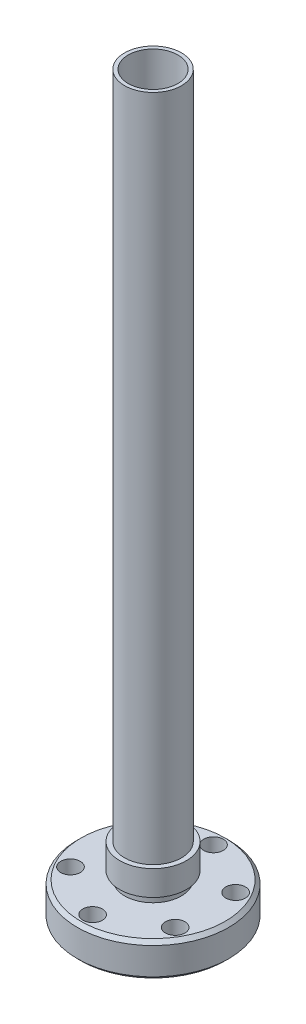
ISO-10303-21;
HEADER;
FILE_DESCRIPTION(('STEP AP214'),'2;1');
FILE_NAME('part.step','',(''),(''),'','','');
FILE_SCHEMA(('AUTOMOTIVE_DESIGN { 1 0 10303 214 1 1 1 1 }'));
ENDSEC;
DATA;
#1=APPLICATION_CONTEXT('core data for automotive mechanical design processes');
#2=APPLICATION_PROTOCOL_DEFINITION('international standard','automotive_design',2000,#1);
#3=PRODUCT_CONTEXT('',#1,'mechanical');
#4=PRODUCT('Part','Part','',(#3));
#5=PRODUCT_RELATED_PRODUCT_CATEGORY('part','',(#4));
#6=PRODUCT_DEFINITION_FORMATION('','',#4);
#7=PRODUCT_DEFINITION_CONTEXT('part definition',#1,'design');
#8=PRODUCT_DEFINITION('design','',#6,#7);
#9=PRODUCT_DEFINITION_SHAPE('','',#8);
#10=(LENGTH_UNIT() NAMED_UNIT(*) SI_UNIT(.MILLI.,.METRE.));
#11=(NAMED_UNIT(*) PLANE_ANGLE_UNIT() SI_UNIT($,.RADIAN.));
#12=(NAMED_UNIT(*) SI_UNIT($,.STERADIAN.) SOLID_ANGLE_UNIT());
#13=UNCERTAINTY_MEASURE_WITH_UNIT(LENGTH_MEASURE(1.E-05),#10,'distance_accuracy_value','');
#14=(GEOMETRIC_REPRESENTATION_CONTEXT(3) GLOBAL_UNCERTAINTY_ASSIGNED_CONTEXT((#13)) GLOBAL_UNIT_ASSIGNED_CONTEXT((#10,
#11,#12)) REPRESENTATION_CONTEXT('',''));
#15=CARTESIAN_POINT('',(0.,0.,0.));
#16=DIRECTION('',(0.,0.,1.));
#17=DIRECTION('',(1.,0.,0.));
#18=AXIS2_PLACEMENT_3D('',#15,#16,#17);
#19=CARTESIAN_POINT('',(0.,164.2364,1.72028497727633E-12));
#20=DIRECTION('',(0.,1.,0.));
#21=DIRECTION('',(0.,0.,-1.));
#22=AXIS2_PLACEMENT_3D('',#19,#20,#21);
#23=PLANE('',#22);
#24=CARTESIAN_POINT('',(0.,164.2364,1.72028497727633E-12));
#25=DIRECTION('',(0.,1.,0.));
#26=DIRECTION('',(1.,0.,0.));
#27=AXIS2_PLACEMENT_3D('',#24,#25,#26);
#28=CIRCLE('',#27,6.35);
#29=CARTESIAN_POINT('',(6.35,164.2364,1.72028497727633E-12));
#30=VERTEX_POINT('',#29);
#31=EDGE_CURVE('E10',#30,#30,#28,.T.);
#32=ORIENTED_EDGE('',*,*,#31,.T.);
#33=EDGE_LOOP('',(#32));
#34=FACE_BOUND('',#33,.T.);
#35=CARTESIAN_POINT('',(0.,164.2364,1.72028497727633E-12));
#36=DIRECTION('',(0.,1.,0.));
#37=DIRECTION('',(1.,0.,0.));
#38=AXIS2_PLACEMENT_3D('',#35,#36,#37);
#39=CIRCLE('',#38,5.5372);
#40=CARTESIAN_POINT('',(5.5372,164.2364,1.72028497727633E-12));
#41=VERTEX_POINT('',#40);
#42=EDGE_CURVE('E219',#41,#41,#39,.T.);
#43=ORIENTED_EDGE('',*,*,#42,.F.);
#44=EDGE_LOOP('',(#43));
#45=FACE_BOUND('',#44,.T.);
#46=ADVANCED_FACE('F15',(#34,#45),#23,.T.);
#47=CARTESIAN_POINT('',(0.,164.2364,1.72028497727633E-12));
#48=DIRECTION('',(0.,-1.,0.));
#49=DIRECTION('',(-1.,0.,0.));
#50=AXIS2_PLACEMENT_3D('',#47,#48,#49);
#51=CYLINDRICAL_SURFACE('',#50,6.35);
#52=ORIENTED_EDGE('',*,*,#31,.F.);
#53=EDGE_LOOP('',(#52));
#54=FACE_BOUND('',#53,.T.);
#55=CARTESIAN_POINT('',(0.,15.0114,1.57236068909729E-13));
#56=DIRECTION('',(0.,1.,0.));
#57=DIRECTION('',(0.,0.,1.));
#58=AXIS2_PLACEMENT_3D('',#55,#56,#57);
#59=CIRCLE('',#58,6.35);
#60=CARTESIAN_POINT('',(0.,15.0114,6.35000000000016));
#61=VERTEX_POINT('',#60);
#62=EDGE_CURVE('E26',#61,#61,#59,.T.);
#63=ORIENTED_EDGE('',*,*,#62,.T.);
#64=EDGE_LOOP('',(#63));
#65=FACE_BOUND('',#64,.T.);
#66=ADVANCED_FACE('F448',(#54,#65),#51,.T.);
#67=CARTESIAN_POINT('',(0.,164.2364,1.72028497727633E-12));
#68=DIRECTION('',(0.,-1.,0.));
#69=DIRECTION('',(-1.,0.,0.));
#70=AXIS2_PLACEMENT_3D('',#67,#68,#69);
#71=CYLINDRICAL_SURFACE('',#70,5.5372);
#72=CARTESIAN_POINT('',(0.,11.8364,1.23979709157249E-13));
#73=DIRECTION('',(0.,1.,0.));
#74=DIRECTION('',(1.,0.,0.));
#75=AXIS2_PLACEMENT_3D('',#72,#73,#74);
#76=CIRCLE('',#75,5.5372);
#77=CARTESIAN_POINT('',(5.5372,11.8364,1.23979709157249E-13));
#78=VERTEX_POINT('',#77);
#79=EDGE_CURVE('E247',#78,#78,#76,.T.);
#80=ORIENTED_EDGE('',*,*,#79,.F.);
#81=EDGE_LOOP('',(#80));
#82=FACE_BOUND('',#81,.T.);
#83=ORIENTED_EDGE('',*,*,#42,.T.);
#84=EDGE_LOOP('',(#83));
#85=FACE_BOUND('',#84,.T.);
#86=ADVANCED_FACE('F549',(#82,#85),#71,.F.);
#87=CARTESIAN_POINT('',(6.4135,15.0114,0.));
#88=DIRECTION('',(0.,1.,0.));
#89=DIRECTION('',(1.,0.,0.));
#90=AXIS2_PLACEMENT_3D('',#87,#88,#89);
#91=PLANE('',#90);
#92=CARTESIAN_POINT('',(0.,15.0114,0.));
#93=DIRECTION('',(0.,1.,0.));
#94=DIRECTION('',(0.,0.,1.));
#95=AXIS2_PLACEMENT_3D('',#92,#93,#94);
#96=CIRCLE('',#95,7.4295);
#97=CARTESIAN_POINT('',(0.,15.0114,7.4295));
#98=VERTEX_POINT('',#97);
#99=EDGE_CURVE('E223',#98,#98,#96,.T.);
#100=ORIENTED_EDGE('',*,*,#99,.T.);
#101=EDGE_LOOP('',(#100));
#102=FACE_BOUND('',#101,.T.);
#103=ORIENTED_EDGE('',*,*,#62,.F.);
#104=EDGE_LOOP('',(#103));
#105=FACE_BOUND('',#104,.T.);
#106=ADVANCED_FACE('F545',(#102,#105),#91,.T.);
#107=CARTESIAN_POINT('',(0.,36.0251993233018,0.));
#108=DIRECTION('',(0.,-1.,0.));
#109=DIRECTION('',(0.,0.,-1.));
#110=AXIS2_PLACEMENT_3D('',#107,#108,#109);
#111=CYLINDRICAL_SURFACE('',#110,7.4295);
#112=CARTESIAN_POINT('',(0.,9.4234,0.));
#113=DIRECTION('',(0.,-1.,0.));
#114=DIRECTION('',(0.,0.,-1.));
#115=AXIS2_PLACEMENT_3D('',#112,#113,#114);
#116=CIRCLE('',#115,7.4295);
#117=CARTESIAN_POINT('',(0.,9.4234,-7.4295));
#118=VERTEX_POINT('',#117);
#119=EDGE_CURVE('E19',#118,#118,#116,.T.);
#120=ORIENTED_EDGE('',*,*,#119,.F.);
#121=EDGE_LOOP('',(#120));
#122=FACE_BOUND('',#121,.T.);
#123=ORIENTED_EDGE('',*,*,#99,.F.);
#124=EDGE_LOOP('',(#123));
#125=FACE_BOUND('',#124,.T.);
#126=ADVANCED_FACE('F186',(#122,#125),#111,.T.);
#127=CARTESIAN_POINT('',(5.3975,11.8364,0.));
#128=DIRECTION('',(0.,1.,0.));
#129=DIRECTION('',(1.,0.,0.));
#130=AXIS2_PLACEMENT_3D('',#127,#128,#129);
#131=PLANE('',#130);
#132=ORIENTED_EDGE('',*,*,#79,.T.);
#133=EDGE_LOOP('',(#132));
#134=FACE_BOUND('',#133,.T.);
#135=CARTESIAN_POINT('',(0.,11.8364,0.));
#136=DIRECTION('',(0.,-1.,0.));
#137=DIRECTION('',(0.,0.,-1.));
#138=AXIS2_PLACEMENT_3D('',#135,#136,#137);
#139=CIRCLE('',#138,5.3975);
#140=CARTESIAN_POINT('',(0.,11.8364,-5.3975));
#141=VERTEX_POINT('',#140);
#142=EDGE_CURVE('E243',#141,#141,#139,.T.);
#143=ORIENTED_EDGE('',*,*,#142,.T.);
#144=EDGE_LOOP('',(#143));
#145=FACE_BOUND('',#144,.T.);
#146=ADVANCED_FACE('F466',(#134,#145),#131,.T.);
#147=CARTESIAN_POINT('',(0.,-8.49931016623051,0.));
#148=DIRECTION('',(0.,-1.,0.));
#149=DIRECTION('',(0.,0.,-1.));
#150=AXIS2_PLACEMENT_3D('',#147,#148,#149);
#151=CYLINDRICAL_SURFACE('',#150,9.144);
#152=CARTESIAN_POINT('',(0.,0.6604,0.));
#153=DIRECTION('',(0.,-1.,0.));
#154=DIRECTION('',(0.,0.,-1.));
#155=AXIS2_PLACEMENT_3D('',#152,#153,#154);
#156=CIRCLE('',#155,9.144);
#157=CARTESIAN_POINT('',(0.,0.6604,-9.144));
#158=VERTEX_POINT('',#157);
#159=EDGE_CURVE('E248',#158,#158,#156,.T.);
#160=ORIENTED_EDGE('',*,*,#159,.T.);
#161=EDGE_LOOP('',(#160));
#162=FACE_BOUND('',#161,.T.);
#163=CARTESIAN_POINT('',(0.,1.1684,0.));
#164=DIRECTION('',(0.,-1.,0.));
#165=DIRECTION('',(0.,0.,-1.));
#166=AXIS2_PLACEMENT_3D('',#163,#164,#165);
#167=CIRCLE('',#166,9.144);
#168=CARTESIAN_POINT('',(0.,1.1684,-9.144));
#169=VERTEX_POINT('',#168);
#170=EDGE_CURVE('E129',#169,#169,#167,.T.);
#171=ORIENTED_EDGE('',*,*,#170,.F.);
#172=EDGE_LOOP('',(#171));
#173=FACE_BOUND('',#172,.T.);
#174=ADVANCED_FACE('F461',(#162,#173),#151,.F.);
#175=CARTESIAN_POINT('',(0.,1.22433548097206,0.));
#176=DIRECTION('',(0.,1.,0.));
#177=DIRECTION('',(0.,0.,1.));
#178=AXIS2_PLACEMENT_3D('',#175,#176,#177);
#179=CONICAL_SURFACE('',#178,10.6934,1.22173047639603);
#180=CARTESIAN_POINT('',(0.,1.22433548097206,0.));
#181=DIRECTION('',(0.,-1.,0.));
#182=DIRECTION('',(0.,0.,-1.));
#183=AXIS2_PLACEMENT_3D('',#180,#181,#182);
#184=CIRCLE('',#183,10.6934);
#185=CARTESIAN_POINT('',(0.,1.22433548097206,-10.6934));
#186=VERTEX_POINT('',#185);
#187=EDGE_CURVE('E136',#186,#186,#184,.T.);
#188=ORIENTED_EDGE('',*,*,#187,.T.);
#189=EDGE_LOOP('',(#188));
#190=FACE_BOUND('',#189,.T.);
#191=ORIENTED_EDGE('',*,*,#159,.F.);
#192=EDGE_LOOP('',(#191));
#193=FACE_BOUND('',#192,.T.);
#194=ADVANCED_FACE('F465',(#190,#193),#179,.T.);
#195=CARTESIAN_POINT('',(0.,-8.49931016623051,0.));
#196=DIRECTION('',(0.,-1.,0.));
#197=DIRECTION('',(0.,0.,-1.));
#198=AXIS2_PLACEMENT_3D('',#195,#196,#197);
#199=CYLINDRICAL_SURFACE('',#198,10.6934);
#200=CARTESIAN_POINT('',(0.,0.,0.));
#201=DIRECTION('',(0.,-1.,0.));
#202=DIRECTION('',(0.,0.,-1.));
#203=AXIS2_PLACEMENT_3D('',#200,#201,#202);
#204=CIRCLE('',#203,10.6934);
#205=CARTESIAN_POINT('',(0.,0.,-10.6934));
#206=VERTEX_POINT('',#205);
#207=EDGE_CURVE('E145',#206,#206,#204,.T.);
#208=ORIENTED_EDGE('',*,*,#207,.T.);
#209=EDGE_LOOP('',(#208));
#210=FACE_BOUND('',#209,.T.);
#211=ORIENTED_EDGE('',*,*,#187,.F.);
#212=EDGE_LOOP('',(#211));
#213=FACE_BOUND('',#212,.T.);
#214=ADVANCED_FACE('F312',(#210,#213),#199,.F.);
#215=CARTESIAN_POINT('',(-10.6934,0.,0.));
#216=DIRECTION('',(0.,1.,0.));
#217=DIRECTION('',(1.,0.,0.));
#218=AXIS2_PLACEMENT_3D('',#215,#216,#217);
#219=PLANE('',#218);
#220=CARTESIAN_POINT('',(0.,0.,0.));
#221=DIRECTION('',(0.,-1.,0.));
#222=DIRECTION('',(0.,0.,1.));
#223=AXIS2_PLACEMENT_3D('',#220,#221,#222);
#224=CIRCLE('',#223,16.1036);
#225=CARTESIAN_POINT('',(0.,0.,16.1036));
#226=VERTEX_POINT('',#225);
#227=EDGE_CURVE('E224',#226,#226,#224,.T.);
#228=ORIENTED_EDGE('',*,*,#227,.T.);
#229=EDGE_LOOP('',(#228));
#230=FACE_BOUND('',#229,.T.);
#231=CARTESIAN_POINT('',(11.6804310310022,0.,-6.74370000000013));
#232=DIRECTION('',(0.,-1.,0.));
#233=DIRECTION('',(0.866025403784433,0.,-0.50000000000001));
#234=AXIS2_PLACEMENT_3D('',#231,#232,#233);
#235=CIRCLE('',#234,2.1844);
#236=CARTESIAN_POINT('',(13.5721769230289,0.,-7.83590000000015));
#237=VERTEX_POINT('',#236);
#238=EDGE_CURVE('E206',#237,#237,#235,.T.);
#239=ORIENTED_EDGE('',*,*,#238,.F.);
#240=EDGE_LOOP('',(#239));
#241=FACE_BOUND('',#240,.T.);
#242=CARTESIAN_POINT('',(11.6804310310023,0.,6.74369999999989));
#243=DIRECTION('',(0.,-1.,0.));
#244=DIRECTION('',(0.866025403784444,0.,0.499999999999992));
#245=AXIS2_PLACEMENT_3D('',#242,#243,#244);
#246=CIRCLE('',#245,2.1844);
#247=CARTESIAN_POINT('',(13.572176923029,0.,7.83589999999988));
#248=VERTEX_POINT('',#247);
#249=EDGE_CURVE('E297',#248,#248,#246,.T.);
#250=ORIENTED_EDGE('',*,*,#249,.F.);
#251=EDGE_LOOP('',(#250));
#252=FACE_BOUND('',#251,.T.);
#253=CARTESIAN_POINT('',(0.,0.,13.4874));
#254=DIRECTION('',(0.,-1.,0.));
#255=DIRECTION('',(0.,0.,1.));
#256=AXIS2_PLACEMENT_3D('',#253,#254,#255);
#257=CIRCLE('',#256,2.1844);
#258=CARTESIAN_POINT('',(1.07783864368282E-13,0.,15.6718));
#259=VERTEX_POINT('',#258);
#260=EDGE_CURVE('E233',#259,#259,#257,.T.);
#261=ORIENTED_EDGE('',*,*,#260,.F.);
#262=EDGE_LOOP('',(#261));
#263=FACE_BOUND('',#262,.T.);
#264=CARTESIAN_POINT('',(-11.6804310310022,0.,6.7437));
#265=DIRECTION('',(0.,-1.,0.));
#266=DIRECTION('',(-0.866025403784437,0.,0.5));
#267=AXIS2_PLACEMENT_3D('',#264,#265,#266);
#268=CIRCLE('',#267,2.1844);
#269=CARTESIAN_POINT('',(-13.5721769230289,0.,7.8359));
#270=VERTEX_POINT('',#269);
#271=EDGE_CURVE('E229',#270,#270,#268,.T.);
#272=ORIENTED_EDGE('',*,*,#271,.F.);
#273=EDGE_LOOP('',(#272));
#274=FACE_BOUND('',#273,.T.);
#275=CARTESIAN_POINT('',(-11.6804310310023,0.,-6.7437));
#276=DIRECTION('',(0.,-1.,0.));
#277=DIRECTION('',(-0.86602540378444,0.,-0.5));
#278=AXIS2_PLACEMENT_3D('',#275,#276,#277);
#279=CIRCLE('',#278,2.1844);
#280=CARTESIAN_POINT('',(-13.572176923029,0.,-7.8359));
#281=VERTEX_POINT('',#280);
#282=EDGE_CURVE('E215',#281,#281,#279,.T.);
#283=ORIENTED_EDGE('',*,*,#282,.F.);
#284=EDGE_LOOP('',(#283));
#285=FACE_BOUND('',#284,.T.);
#286=CARTESIAN_POINT('',(0.,0.,-13.4874));
#287=DIRECTION('',(0.,-1.,0.));
#288=DIRECTION('',(0.,0.,-1.));
#289=AXIS2_PLACEMENT_3D('',#286,#287,#288);
#290=CIRCLE('',#289,2.1844);
#291=CARTESIAN_POINT('',(0.,0.,-15.6718));
#292=VERTEX_POINT('',#291);
#293=EDGE_CURVE('E212',#292,#292,#290,.T.);
#294=ORIENTED_EDGE('',*,*,#293,.F.);
#295=EDGE_LOOP('',(#294));
#296=FACE_BOUND('',#295,.T.);
#297=ORIENTED_EDGE('',*,*,#207,.F.);
#298=EDGE_LOOP('',(#297));
#299=FACE_BOUND('',#298,.T.);
#300=ADVANCED_FACE('F308',(#230,#241,#252,#263,#274,#285,#296,#299),#219,.F.);
#301=CARTESIAN_POINT('',(0.,-8.49931016623051,0.));
#302=DIRECTION('',(0.,-1.,0.));
#303=DIRECTION('',(0.,0.,-1.));
#304=AXIS2_PLACEMENT_3D('',#301,#302,#303);
#305=CYLINDRICAL_SURFACE('',#304,16.891);
#306=CARTESIAN_POINT('',(0.,0.7874,0.));
#307=DIRECTION('',(0.,1.,0.));
#308=DIRECTION('',(0.,0.,1.));
#309=AXIS2_PLACEMENT_3D('',#306,#307,#308);
#310=CIRCLE('',#309,16.891);
#311=CARTESIAN_POINT('',(0.,0.7874,16.891));
#312=VERTEX_POINT('',#311);
#313=EDGE_CURVE('E228',#312,#312,#310,.T.);
#314=ORIENTED_EDGE('',*,*,#313,.T.);
#315=EDGE_LOOP('',(#314));
#316=FACE_BOUND('',#315,.T.);
#317=CARTESIAN_POINT('',(0.,6.8326,0.));
#318=DIRECTION('',(0.,-1.,0.));
#319=DIRECTION('',(0.,0.,-1.));
#320=AXIS2_PLACEMENT_3D('',#317,#318,#319);
#321=CIRCLE('',#320,16.891);
#322=CARTESIAN_POINT('',(0.,6.8326,-16.891));
#323=VERTEX_POINT('',#322);
#324=EDGE_CURVE('E210',#323,#323,#321,.T.);
#325=ORIENTED_EDGE('',*,*,#324,.T.);
#326=EDGE_LOOP('',(#325));
#327=FACE_BOUND('',#326,.T.);
#328=ADVANCED_FACE('F311',(#316,#327),#305,.T.);
#329=CARTESIAN_POINT('',(0.,7.62,0.));
#330=DIRECTION('',(0.,-1.,0.));
#331=DIRECTION('',(0.,0.,-1.));
#332=AXIS2_PLACEMENT_3D('',#329,#330,#331);
#333=PLANE('',#332);
#334=CARTESIAN_POINT('',(0.,7.62,0.));
#335=DIRECTION('',(0.,1.,0.));
#336=DIRECTION('',(0.,0.,-1.));
#337=AXIS2_PLACEMENT_3D('',#334,#335,#336);
#338=CIRCLE('',#337,16.1036);
#339=CARTESIAN_POINT('',(0.,7.62,-16.1036));
#340=VERTEX_POINT('',#339);
#341=EDGE_CURVE('E249',#340,#340,#338,.T.);
#342=ORIENTED_EDGE('',*,*,#341,.T.);
#343=EDGE_LOOP('',(#342));
#344=FACE_BOUND('',#343,.T.);
#345=CARTESIAN_POINT('',(0.,7.62,0.));
#346=DIRECTION('',(0.,-1.,0.));
#347=DIRECTION('',(0.,0.,-1.));
#348=AXIS2_PLACEMENT_3D('',#345,#346,#347);
#349=CIRCLE('',#348,6.3119);
#350=CARTESIAN_POINT('',(0.,7.62,-6.3119));
#351=VERTEX_POINT('',#350);
#352=EDGE_CURVE('E176',#351,#351,#349,.T.);
#353=ORIENTED_EDGE('',*,*,#352,.T.);
#354=EDGE_LOOP('',(#353));
#355=FACE_BOUND('',#354,.T.);
#356=CARTESIAN_POINT('',(11.6804310310022,7.62,-6.74370000000013));
#357=DIRECTION('',(0.,-1.,0.));
#358=DIRECTION('',(0.866025403784433,0.,-0.50000000000001));
#359=AXIS2_PLACEMENT_3D('',#356,#357,#358);
#360=CIRCLE('',#359,2.1844);
#361=CARTESIAN_POINT('',(13.5721769230289,7.62,-7.83590000000015));
#362=VERTEX_POINT('',#361);
#363=EDGE_CURVE('E166',#362,#362,#360,.T.);
#364=ORIENTED_EDGE('',*,*,#363,.T.);
#365=EDGE_LOOP('',(#364));
#366=FACE_BOUND('',#365,.T.);
#367=CARTESIAN_POINT('',(11.6804310310023,7.62,6.74369999999989));
#368=DIRECTION('',(0.,-1.,0.));
#369=DIRECTION('',(0.866025403784444,0.,0.499999999999992));
#370=AXIS2_PLACEMENT_3D('',#367,#368,#369);
#371=CIRCLE('',#370,2.1844);
#372=CARTESIAN_POINT('',(13.572176923029,7.62,7.83589999999988));
#373=VERTEX_POINT('',#372);
#374=EDGE_CURVE('E258',#373,#373,#371,.T.);
#375=ORIENTED_EDGE('',*,*,#374,.T.);
#376=EDGE_LOOP('',(#375));
#377=FACE_BOUND('',#376,.T.);
#378=CARTESIAN_POINT('',(0.,7.62,13.4874));
#379=DIRECTION('',(0.,-1.,0.));
#380=DIRECTION('',(0.,0.,1.));
#381=AXIS2_PLACEMENT_3D('',#378,#379,#380);
#382=CIRCLE('',#381,2.1844);
#383=CARTESIAN_POINT('',(1.07783864368282E-13,7.62,15.6718));
#384=VERTEX_POINT('',#383);
#385=EDGE_CURVE('E95',#384,#384,#382,.T.);
#386=ORIENTED_EDGE('',*,*,#385,.T.);
#387=EDGE_LOOP('',(#386));
#388=FACE_BOUND('',#387,.T.);
#389=CARTESIAN_POINT('',(-11.6804310310022,7.62,6.7437));
#390=DIRECTION('',(0.,-1.,0.));
#391=DIRECTION('',(-0.866025403784437,0.,0.5));
#392=AXIS2_PLACEMENT_3D('',#389,#390,#391);
#393=CIRCLE('',#392,2.1844);
#394=CARTESIAN_POINT('',(-13.5721769230289,7.62,7.8359));
#395=VERTEX_POINT('',#394);
#396=EDGE_CURVE('E84',#395,#395,#393,.T.);
#397=ORIENTED_EDGE('',*,*,#396,.T.);
#398=EDGE_LOOP('',(#397));
#399=FACE_BOUND('',#398,.T.);
#400=CARTESIAN_POINT('',(-11.6804310310023,7.62,-6.7437));
#401=DIRECTION('',(0.,-1.,0.));
#402=DIRECTION('',(-0.86602540378444,0.,-0.5));
#403=AXIS2_PLACEMENT_3D('',#400,#401,#402);
#404=CIRCLE('',#403,2.1844);
#405=CARTESIAN_POINT('',(-13.572176923029,7.62,-7.8359));
#406=VERTEX_POINT('',#405);
#407=EDGE_CURVE('E218',#406,#406,#404,.T.);
#408=ORIENTED_EDGE('',*,*,#407,.T.);
#409=EDGE_LOOP('',(#408));
#410=FACE_BOUND('',#409,.T.);
#411=CARTESIAN_POINT('',(0.,7.62,-13.4874));
#412=DIRECTION('',(0.,-1.,0.));
#413=DIRECTION('',(0.,0.,-1.));
#414=AXIS2_PLACEMENT_3D('',#411,#412,#413);
#415=CIRCLE('',#414,2.1844);
#416=CARTESIAN_POINT('',(0.,7.62,-15.6718));
#417=VERTEX_POINT('',#416);
#418=EDGE_CURVE('E240',#417,#417,#415,.T.);
#419=ORIENTED_EDGE('',*,*,#418,.T.);
#420=EDGE_LOOP('',(#419));
#421=FACE_BOUND('',#420,.T.);
#422=ADVANCED_FACE('F503',(#344,#355,#366,#377,#388,#399,#410,#421),#333,.F.);
#423=CARTESIAN_POINT('',(0.,1.1684,0.));
#424=DIRECTION('',(0.,1.,0.));
#425=DIRECTION('',(1.,0.,0.));
#426=AXIS2_PLACEMENT_3D('',#423,#424,#425);
#427=PLANE('',#426);
#428=ORIENTED_EDGE('',*,*,#170,.T.);
#429=EDGE_LOOP('',(#428));
#430=FACE_BOUND('',#429,.T.);
#431=CARTESIAN_POINT('',(0.,1.1684,0.));
#432=DIRECTION('',(0.,-1.,0.));
#433=DIRECTION('',(0.,0.,-1.));
#434=AXIS2_PLACEMENT_3D('',#431,#432,#433);
#435=CIRCLE('',#434,5.3975);
#436=CARTESIAN_POINT('',(0.,1.1684,-5.3975));
#437=VERTEX_POINT('',#436);
#438=EDGE_CURVE('E197',#437,#437,#435,.T.);
#439=ORIENTED_EDGE('',*,*,#438,.F.);
#440=EDGE_LOOP('',(#439));
#441=FACE_BOUND('',#440,.T.);
#442=ADVANCED_FACE('F326',(#430,#441),#427,.F.);
#443=CARTESIAN_POINT('',(0.,7.62,-13.4874));
#444=DIRECTION('',(0.,-1.,0.));
#445=DIRECTION('',(0.,0.,-1.));
#446=AXIS2_PLACEMENT_3D('',#443,#444,#445);
#447=CYLINDRICAL_SURFACE('',#446,2.1844);
#448=ORIENTED_EDGE('',*,*,#293,.T.);
#449=EDGE_LOOP('',(#448));
#450=FACE_BOUND('',#449,.T.);
#451=ORIENTED_EDGE('',*,*,#418,.F.);
#452=EDGE_LOOP('',(#451));
#453=FACE_BOUND('',#452,.T.);
#454=ADVANCED_FACE('F322',(#450,#453),#447,.F.);
#455=CARTESIAN_POINT('',(-11.6804310310023,7.62,-6.7437));
#456=DIRECTION('',(0.,-1.,0.));
#457=DIRECTION('',(0.,0.,-1.));
#458=AXIS2_PLACEMENT_3D('',#455,#456,#457);
#459=CYLINDRICAL_SURFACE('',#458,2.1844);
#460=ORIENTED_EDGE('',*,*,#282,.T.);
#461=EDGE_LOOP('',(#460));
#462=FACE_BOUND('',#461,.T.);
#463=ORIENTED_EDGE('',*,*,#407,.F.);
#464=EDGE_LOOP('',(#463));
#465=FACE_BOUND('',#464,.T.);
#466=ADVANCED_FACE('F325',(#462,#465),#459,.F.);
#467=CARTESIAN_POINT('',(-11.6804310310022,7.62,6.7437));
#468=DIRECTION('',(0.,-1.,0.));
#469=DIRECTION('',(0.,0.,-1.));
#470=AXIS2_PLACEMENT_3D('',#467,#468,#469);
#471=CYLINDRICAL_SURFACE('',#470,2.1844);
#472=ORIENTED_EDGE('',*,*,#271,.T.);
#473=EDGE_LOOP('',(#472));
#474=FACE_BOUND('',#473,.T.);
#475=ORIENTED_EDGE('',*,*,#396,.F.);
#476=EDGE_LOOP('',(#475));
#477=FACE_BOUND('',#476,.T.);
#478=ADVANCED_FACE('F524',(#474,#477),#471,.F.);
#479=CARTESIAN_POINT('',(0.,7.62,13.4874));
#480=DIRECTION('',(0.,-1.,0.));
#481=DIRECTION('',(0.,0.,-1.));
#482=AXIS2_PLACEMENT_3D('',#479,#480,#481);
#483=CYLINDRICAL_SURFACE('',#482,2.1844);
#484=ORIENTED_EDGE('',*,*,#260,.T.);
#485=EDGE_LOOP('',(#484));
#486=FACE_BOUND('',#485,.T.);
#487=ORIENTED_EDGE('',*,*,#385,.F.);
#488=EDGE_LOOP('',(#487));
#489=FACE_BOUND('',#488,.T.);
#490=ADVANCED_FACE('F515',(#486,#489),#483,.F.);
#491=CARTESIAN_POINT('',(11.6804310310023,7.62,6.74369999999989));
#492=DIRECTION('',(0.,-1.,0.));
#493=DIRECTION('',(0.,0.,-1.));
#494=AXIS2_PLACEMENT_3D('',#491,#492,#493);
#495=CYLINDRICAL_SURFACE('',#494,2.1844);
#496=ORIENTED_EDGE('',*,*,#249,.T.);
#497=EDGE_LOOP('',(#496));
#498=FACE_BOUND('',#497,.T.);
#499=ORIENTED_EDGE('',*,*,#374,.F.);
#500=EDGE_LOOP('',(#499));
#501=FACE_BOUND('',#500,.T.);
#502=ADVANCED_FACE('F498',(#498,#501),#495,.F.);
#503=CARTESIAN_POINT('',(11.6804310310022,7.62,-6.74370000000013));
#504=DIRECTION('',(0.,-1.,0.));
#505=DIRECTION('',(0.,0.,-1.));
#506=AXIS2_PLACEMENT_3D('',#503,#504,#505);
#507=CYLINDRICAL_SURFACE('',#506,2.1844);
#508=ORIENTED_EDGE('',*,*,#238,.T.);
#509=EDGE_LOOP('',(#508));
#510=FACE_BOUND('',#509,.T.);
#511=ORIENTED_EDGE('',*,*,#363,.F.);
#512=EDGE_LOOP('',(#511));
#513=FACE_BOUND('',#512,.T.);
#514=ADVANCED_FACE('F306',(#510,#513),#507,.F.);
#515=CARTESIAN_POINT('',(0.,6.8326,0.));
#516=DIRECTION('',(0.,-1.,0.));
#517=DIRECTION('',(0.,0.,-1.));
#518=AXIS2_PLACEMENT_3D('',#515,#516,#517);
#519=CONICAL_SURFACE('',#518,16.891,0.785398163397453);
#520=ORIENTED_EDGE('',*,*,#324,.F.);
#521=EDGE_LOOP('',(#520));
#522=FACE_BOUND('',#521,.T.);
#523=ORIENTED_EDGE('',*,*,#341,.F.);
#524=EDGE_LOOP('',(#523));
#525=FACE_BOUND('',#524,.T.);
#526=ADVANCED_FACE('F497',(#522,#525),#519,.T.);
#527=CARTESIAN_POINT('',(0.,0.,0.));
#528=DIRECTION('',(0.,1.,0.));
#529=DIRECTION('',(0.,0.,1.));
#530=AXIS2_PLACEMENT_3D('',#527,#528,#529);
#531=CONICAL_SURFACE('',#530,16.1036,0.785398163397448);
#532=ORIENTED_EDGE('',*,*,#313,.F.);
#533=EDGE_LOOP('',(#532));
#534=FACE_BOUND('',#533,.T.);
#535=ORIENTED_EDGE('',*,*,#227,.F.);
#536=EDGE_LOOP('',(#535));
#537=FACE_BOUND('',#536,.T.);
#538=ADVANCED_FACE('F488',(#534,#537),#531,.T.);
#539=CARTESIAN_POINT('',(0.,25.5805122421383,0.));
#540=DIRECTION('',(0.,-1.,0.));
#541=DIRECTION('',(0.,0.,-1.));
#542=AXIS2_PLACEMENT_3D('',#539,#540,#541);
#543=CYLINDRICAL_SURFACE('',#542,5.3975);
#544=ORIENTED_EDGE('',*,*,#142,.F.);
#545=EDGE_LOOP('',(#544));
#546=FACE_BOUND('',#545,.T.);
#547=ORIENTED_EDGE('',*,*,#438,.T.);
#548=EDGE_LOOP('',(#547));
#549=FACE_BOUND('',#548,.T.);
#550=ADVANCED_FACE('F456',(#546,#549),#543,.F.);
#551=CARTESIAN_POINT('',(0.,1.1684,0.));
#552=DIRECTION('',(0.,-1.,0.));
#553=DIRECTION('',(0.,0.,-1.));
#554=AXIS2_PLACEMENT_3D('',#551,#552,#553);
#555=CYLINDRICAL_SURFACE('',#554,6.3119);
#556=ORIENTED_EDGE('',*,*,#352,.F.);
#557=EDGE_LOOP('',(#556));
#558=FACE_BOUND('',#557,.T.);
#559=CARTESIAN_POINT('',(0.,9.4234,0.));
#560=DIRECTION('',(0.,-1.,0.));
#561=DIRECTION('',(0.,0.,-1.));
#562=AXIS2_PLACEMENT_3D('',#559,#560,#561);
#563=CIRCLE('',#562,6.3119);
#564=CARTESIAN_POINT('',(0.,9.4234,-6.3119));
#565=VERTEX_POINT('',#564);
#566=EDGE_CURVE('E190',#565,#565,#563,.T.);
#567=ORIENTED_EDGE('',*,*,#566,.T.);
#568=EDGE_LOOP('',(#567));
#569=FACE_BOUND('',#568,.T.);
#570=ADVANCED_FACE('F441',(#558,#569),#555,.T.);
#571=CARTESIAN_POINT('',(7.4295,9.4234,0.));
#572=DIRECTION('',(0.,-1.,0.));
#573=DIRECTION('',(0.,0.,-1.));
#574=AXIS2_PLACEMENT_3D('',#571,#572,#573);
#575=PLANE('',#574);
#576=ORIENTED_EDGE('',*,*,#119,.T.);
#577=EDGE_LOOP('',(#576));
#578=FACE_BOUND('',#577,.T.);
#579=ORIENTED_EDGE('',*,*,#566,.F.);
#580=EDGE_LOOP('',(#579));
#581=FACE_BOUND('',#580,.T.);
#582=ADVANCED_FACE('F17',(#578,#581),#575,.T.);
#583=CLOSED_SHELL('',(#46,#66,#86,#106,#126,#146,#174,#194,#214,#300,#328,#422,#442,#454,#466,
#478,#490,#502,#514,#526,#538,#550,#570,#582));
#584=MANIFOLD_SOLID_BREP('B1',#583);
#585=ADVANCED_BREP_SHAPE_REPRESENTATION('',(#18,#584),#14);
#586=SHAPE_DEFINITION_REPRESENTATION(#9,#585);
ENDSEC;
END-ISO-10303-21;
